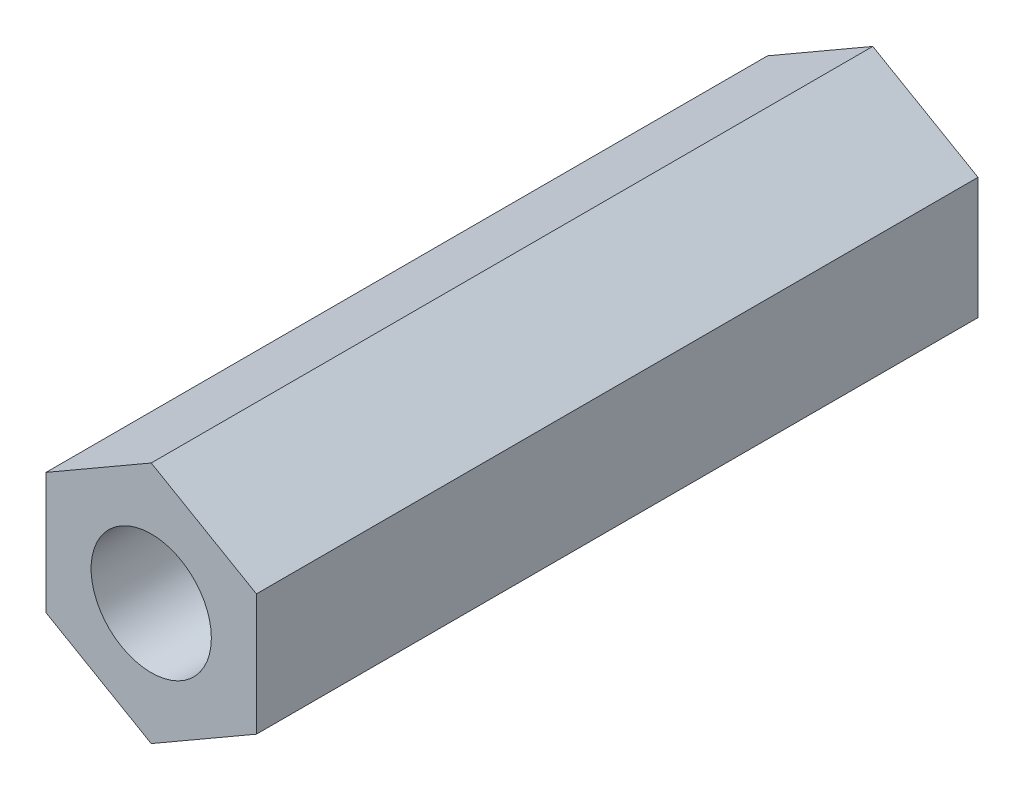
ISO-10303-21;
HEADER;
FILE_DESCRIPTION(('STEP AP214'),'2;1');
FILE_NAME('part.step','',(''),(''),'','','');
FILE_SCHEMA(('AUTOMOTIVE_DESIGN { 1 0 10303 214 1 1 1 1 }'));
ENDSEC;
DATA;
#1=APPLICATION_CONTEXT('core data for automotive mechanical design processes');
#2=APPLICATION_PROTOCOL_DEFINITION('international standard','automotive_design',2000,#1);
#3=PRODUCT_CONTEXT('',#1,'mechanical');
#4=PRODUCT('Part','Part','',(#3));
#5=PRODUCT_RELATED_PRODUCT_CATEGORY('part','',(#4));
#6=PRODUCT_DEFINITION_FORMATION('','',#4);
#7=PRODUCT_DEFINITION_CONTEXT('part definition',#1,'design');
#8=PRODUCT_DEFINITION('design','',#6,#7);
#9=PRODUCT_DEFINITION_SHAPE('','',#8);
#10=(LENGTH_UNIT() NAMED_UNIT(*) SI_UNIT(.MILLI.,.METRE.));
#11=(NAMED_UNIT(*) PLANE_ANGLE_UNIT() SI_UNIT($,.RADIAN.));
#12=(NAMED_UNIT(*) SI_UNIT($,.STERADIAN.) SOLID_ANGLE_UNIT());
#13=UNCERTAINTY_MEASURE_WITH_UNIT(LENGTH_MEASURE(1.E-05),#10,'distance_accuracy_value','');
#14=(GEOMETRIC_REPRESENTATION_CONTEXT(3) GLOBAL_UNCERTAINTY_ASSIGNED_CONTEXT((#13)) GLOBAL_UNIT_ASSIGNED_CONTEXT((#10,
#11,#12)) REPRESENTATION_CONTEXT('',''));
#15=CARTESIAN_POINT('',(0.,0.,0.));
#16=DIRECTION('',(0.,0.,1.));
#17=DIRECTION('',(1.,0.,0.));
#18=AXIS2_PLACEMENT_3D('',#15,#16,#17);
#19=CARTESIAN_POINT('',(3.5,2.02072594216369,24.));
#20=DIRECTION('',(-0.5,-0.866025403784439,0.));
#21=DIRECTION('',(0.866025403784439,-0.5,0.));
#22=AXIS2_PLACEMENT_3D('',#19,#20,#21);
#23=PLANE('',#22);
#24=DIRECTION('',(-0.866025403784439,0.499999999999999,0.));
#25=VECTOR('',#24,1.);
#26=CARTESIAN_POINT('',(3.5,2.02072594216369,0.));
#27=LINE('',#26,#25);
#28=CARTESIAN_POINT('',(3.5,2.02072594216369,0.));
#29=VERTEX_POINT('',#28);
#30=CARTESIAN_POINT('',(0.,4.04145188432738,0.));
#31=VERTEX_POINT('',#30);
#32=EDGE_CURVE('E116',#29,#31,#27,.T.);
#33=ORIENTED_EDGE('',*,*,#32,.T.);
#34=DIRECTION('',(0.,0.,-1.));
#35=VECTOR('',#34,1.);
#36=CARTESIAN_POINT('',(0.,4.04145188432738,24.));
#37=LINE('',#36,#35);
#38=CARTESIAN_POINT('',(0.,4.04145188432738,24.));
#39=VERTEX_POINT('',#38);
#40=EDGE_CURVE('E11',#39,#31,#37,.T.);
#41=ORIENTED_EDGE('',*,*,#40,.F.);
#42=DIRECTION('',(-0.866025403784439,0.499999999999999,0.));
#43=VECTOR('',#42,1.);
#44=CARTESIAN_POINT('',(3.5,2.02072594216369,24.));
#45=LINE('',#44,#43);
#46=CARTESIAN_POINT('',(3.5,2.02072594216369,24.));
#47=VERTEX_POINT('',#46);
#48=EDGE_CURVE('E127',#47,#39,#45,.T.);
#49=ORIENTED_EDGE('',*,*,#48,.F.);
#50=DIRECTION('',(0.,0.,-1.));
#51=VECTOR('',#50,1.);
#52=CARTESIAN_POINT('',(3.5,2.02072594216369,24.));
#53=LINE('',#52,#51);
#54=EDGE_CURVE('E112',#47,#29,#53,.T.);
#55=ORIENTED_EDGE('',*,*,#54,.T.);
#56=EDGE_LOOP('',(#33,#41,#49,#55));
#57=FACE_BOUND('',#56,.T.);
#58=ADVANCED_FACE('F32',(#57),#23,.F.);
#59=CARTESIAN_POINT('',(0.,4.04145188432738,24.));
#60=DIRECTION('',(0.5,-0.866025403784439,0.));
#61=DIRECTION('',(0.866025403784439,0.5,0.));
#62=AXIS2_PLACEMENT_3D('',#59,#60,#61);
#63=PLANE('',#62);
#64=DIRECTION('',(-0.866025403784438,-0.5,0.));
#65=VECTOR('',#64,1.);
#66=CARTESIAN_POINT('',(0.,4.04145188432738,0.));
#67=LINE('',#66,#65);
#68=CARTESIAN_POINT('',(-3.5,2.02072594216369,0.));
#69=VERTEX_POINT('',#68);
#70=EDGE_CURVE('E119',#31,#69,#67,.T.);
#71=ORIENTED_EDGE('',*,*,#70,.T.);
#72=DIRECTION('',(0.,0.,-1.));
#73=VECTOR('',#72,1.);
#74=CARTESIAN_POINT('',(-3.5,2.02072594216369,24.));
#75=LINE('',#74,#73);
#76=CARTESIAN_POINT('',(-3.5,2.02072594216369,24.));
#77=VERTEX_POINT('',#76);
#78=EDGE_CURVE('E40',#77,#69,#75,.T.);
#79=ORIENTED_EDGE('',*,*,#78,.F.);
#80=DIRECTION('',(-0.866025403784438,-0.5,0.));
#81=VECTOR('',#80,1.);
#82=CARTESIAN_POINT('',(0.,4.04145188432738,24.));
#83=LINE('',#82,#81);
#84=EDGE_CURVE('E85',#39,#77,#83,.T.);
#85=ORIENTED_EDGE('',*,*,#84,.F.);
#86=ORIENTED_EDGE('',*,*,#40,.T.);
#87=EDGE_LOOP('',(#71,#79,#85,#86));
#88=FACE_BOUND('',#87,.T.);
#89=ADVANCED_FACE('F152',(#88),#63,.F.);
#90=CARTESIAN_POINT('',(-3.5,2.02072594216369,24.));
#91=DIRECTION('',(1.,0.,0.));
#92=DIRECTION('',(0.,1.,0.));
#93=AXIS2_PLACEMENT_3D('',#90,#91,#92);
#94=PLANE('',#93);
#95=DIRECTION('',(0.,-1.,0.));
#96=VECTOR('',#95,1.);
#97=CARTESIAN_POINT('',(-3.5,2.02072594216369,0.));
#98=LINE('',#97,#96);
#99=CARTESIAN_POINT('',(-3.5,-2.02072594216369,0.));
#100=VERTEX_POINT('',#99);
#101=EDGE_CURVE('E122',#69,#100,#98,.T.);
#102=ORIENTED_EDGE('',*,*,#101,.T.);
#103=DIRECTION('',(0.,0.,-1.));
#104=VECTOR('',#103,1.);
#105=CARTESIAN_POINT('',(-3.5,-2.02072594216369,24.));
#106=LINE('',#105,#104);
#107=CARTESIAN_POINT('',(-3.5,-2.02072594216369,24.));
#108=VERTEX_POINT('',#107);
#109=EDGE_CURVE('E107',#108,#100,#106,.T.);
#110=ORIENTED_EDGE('',*,*,#109,.F.);
#111=DIRECTION('',(0.,-1.,0.));
#112=VECTOR('',#111,1.);
#113=CARTESIAN_POINT('',(-3.5,2.02072594216369,24.));
#114=LINE('',#113,#112);
#115=EDGE_CURVE('E98',#77,#108,#114,.T.);
#116=ORIENTED_EDGE('',*,*,#115,.F.);
#117=ORIENTED_EDGE('',*,*,#78,.T.);
#118=EDGE_LOOP('',(#102,#110,#116,#117));
#119=FACE_BOUND('',#118,.T.);
#120=ADVANCED_FACE('F133',(#119),#94,.F.);
#121=CARTESIAN_POINT('',(-3.5,-2.02072594216369,24.));
#122=DIRECTION('',(0.5,0.866025403784439,0.));
#123=DIRECTION('',(-0.866025403784439,0.5,0.));
#124=AXIS2_PLACEMENT_3D('',#121,#122,#123);
#125=PLANE('',#124);
#126=DIRECTION('',(0.866025403784438,-0.5,0.));
#127=VECTOR('',#126,1.);
#128=CARTESIAN_POINT('',(-3.5,-2.02072594216369,0.));
#129=LINE('',#128,#127);
#130=CARTESIAN_POINT('',(0.,-4.04145188432738,0.));
#131=VERTEX_POINT('',#130);
#132=EDGE_CURVE('E106',#100,#131,#129,.T.);
#133=ORIENTED_EDGE('',*,*,#132,.T.);
#134=DIRECTION('',(0.,0.,-1.));
#135=VECTOR('',#134,1.);
#136=CARTESIAN_POINT('',(0.,-4.04145188432738,24.));
#137=LINE('',#136,#135);
#138=CARTESIAN_POINT('',(0.,-4.04145188432738,24.));
#139=VERTEX_POINT('',#138);
#140=EDGE_CURVE('E103',#139,#131,#137,.T.);
#141=ORIENTED_EDGE('',*,*,#140,.F.);
#142=DIRECTION('',(0.866025403784438,-0.5,0.));
#143=VECTOR('',#142,1.);
#144=CARTESIAN_POINT('',(-3.5,-2.02072594216369,24.));
#145=LINE('',#144,#143);
#146=EDGE_CURVE('E92',#108,#139,#145,.T.);
#147=ORIENTED_EDGE('',*,*,#146,.F.);
#148=ORIENTED_EDGE('',*,*,#109,.T.);
#149=EDGE_LOOP('',(#133,#141,#147,#148));
#150=FACE_BOUND('',#149,.T.);
#151=ADVANCED_FACE('F104',(#150),#125,.F.);
#152=CARTESIAN_POINT('',(0.,-4.04145188432738,24.));
#153=DIRECTION('',(-0.5,0.866025403784439,0.));
#154=DIRECTION('',(-0.866025403784439,-0.5,0.));
#155=AXIS2_PLACEMENT_3D('',#152,#153,#154);
#156=PLANE('',#155);
#157=DIRECTION('',(0.866025403784439,0.5,0.));
#158=VECTOR('',#157,1.);
#159=CARTESIAN_POINT('',(0.,-4.04145188432738,0.));
#160=LINE('',#159,#158);
#161=CARTESIAN_POINT('',(3.5,-2.02072594216369,0.));
#162=VERTEX_POINT('',#161);
#163=EDGE_CURVE('E71',#131,#162,#160,.T.);
#164=ORIENTED_EDGE('',*,*,#163,.T.);
#165=DIRECTION('',(0.,0.,-1.));
#166=VECTOR('',#165,1.);
#167=CARTESIAN_POINT('',(3.5,-2.02072594216369,24.));
#168=LINE('',#167,#166);
#169=CARTESIAN_POINT('',(3.5,-2.02072594216369,24.));
#170=VERTEX_POINT('',#169);
#171=EDGE_CURVE('E108',#170,#162,#168,.T.);
#172=ORIENTED_EDGE('',*,*,#171,.F.);
#173=DIRECTION('',(0.866025403784439,0.5,0.));
#174=VECTOR('',#173,1.);
#175=CARTESIAN_POINT('',(0.,-4.04145188432738,24.));
#176=LINE('',#175,#174);
#177=EDGE_CURVE('E96',#139,#170,#176,.T.);
#178=ORIENTED_EDGE('',*,*,#177,.F.);
#179=ORIENTED_EDGE('',*,*,#140,.T.);
#180=EDGE_LOOP('',(#164,#172,#178,#179));
#181=FACE_BOUND('',#180,.T.);
#182=ADVANCED_FACE('F110',(#181),#156,.F.);
#183=CARTESIAN_POINT('',(3.5,-2.02072594216369,24.));
#184=DIRECTION('',(-1.,0.,0.));
#185=DIRECTION('',(0.,-1.,0.));
#186=AXIS2_PLACEMENT_3D('',#183,#184,#185);
#187=PLANE('',#186);
#188=DIRECTION('',(0.,1.,0.));
#189=VECTOR('',#188,1.);
#190=CARTESIAN_POINT('',(3.5,-2.02072594216369,0.));
#191=LINE('',#190,#189);
#192=EDGE_CURVE('E77',#162,#29,#191,.T.);
#193=ORIENTED_EDGE('',*,*,#192,.T.);
#194=ORIENTED_EDGE('',*,*,#54,.F.);
#195=DIRECTION('',(0.,1.,0.));
#196=VECTOR('',#195,1.);
#197=CARTESIAN_POINT('',(3.5,-2.02072594216369,24.));
#198=LINE('',#197,#196);
#199=EDGE_CURVE('E48',#170,#47,#198,.T.);
#200=ORIENTED_EDGE('',*,*,#199,.F.);
#201=ORIENTED_EDGE('',*,*,#171,.T.);
#202=EDGE_LOOP('',(#193,#194,#200,#201));
#203=FACE_BOUND('',#202,.T.);
#204=ADVANCED_FACE('F140',(#203),#187,.F.);
#205=CARTESIAN_POINT('',(0.,0.,24.));
#206=DIRECTION('',(0.,0.,1.));
#207=DIRECTION('',(1.,0.,0.));
#208=AXIS2_PLACEMENT_3D('',#205,#206,#207);
#209=PLANE('',#208);
#210=CARTESIAN_POINT('',(0.,0.,24.));
#211=DIRECTION('',(0.,0.,1.));
#212=DIRECTION('',(1.,0.,0.));
#213=AXIS2_PLACEMENT_3D('',#210,#211,#212);
#214=CIRCLE('',#213,2.);
#215=CARTESIAN_POINT('',(2.,0.,24.));
#216=VERTEX_POINT('',#215);
#217=EDGE_CURVE('E207',#216,#216,#214,.T.);
#218=ORIENTED_EDGE('',*,*,#217,.F.);
#219=EDGE_LOOP('',(#218));
#220=FACE_BOUND('',#219,.T.);
#221=ORIENTED_EDGE('',*,*,#48,.T.);
#222=ORIENTED_EDGE('',*,*,#84,.T.);
#223=ORIENTED_EDGE('',*,*,#115,.T.);
#224=ORIENTED_EDGE('',*,*,#146,.T.);
#225=ORIENTED_EDGE('',*,*,#177,.T.);
#226=ORIENTED_EDGE('',*,*,#199,.T.);
#227=EDGE_LOOP('',(#221,#222,#223,#224,#225,#226));
#228=FACE_BOUND('',#227,.T.);
#229=ADVANCED_FACE('F94',(#220,#228),#209,.T.);
#230=CARTESIAN_POINT('',(0.,0.,0.));
#231=DIRECTION('',(0.,0.,1.));
#232=DIRECTION('',(1.,0.,0.));
#233=AXIS2_PLACEMENT_3D('',#230,#231,#232);
#234=PLANE('',#233);
#235=CARTESIAN_POINT('',(0.,0.,0.));
#236=DIRECTION('',(0.,0.,1.));
#237=DIRECTION('',(1.,0.,0.));
#238=AXIS2_PLACEMENT_3D('',#235,#236,#237);
#239=CIRCLE('',#238,2.);
#240=CARTESIAN_POINT('',(2.,0.,0.));
#241=VERTEX_POINT('',#240);
#242=EDGE_CURVE('E120',#241,#241,#239,.T.);
#243=ORIENTED_EDGE('',*,*,#242,.T.);
#244=EDGE_LOOP('',(#243));
#245=FACE_BOUND('',#244,.T.);
#246=ORIENTED_EDGE('',*,*,#32,.F.);
#247=ORIENTED_EDGE('',*,*,#192,.F.);
#248=ORIENTED_EDGE('',*,*,#163,.F.);
#249=ORIENTED_EDGE('',*,*,#132,.F.);
#250=ORIENTED_EDGE('',*,*,#101,.F.);
#251=ORIENTED_EDGE('',*,*,#70,.F.);
#252=EDGE_LOOP('',(#246,#247,#248,#249,#250,#251));
#253=FACE_BOUND('',#252,.T.);
#254=ADVANCED_FACE('F136',(#245,#253),#234,.F.);
#255=CARTESIAN_POINT('',(0.,0.,0.));
#256=DIRECTION('',(0.,0.,1.));
#257=DIRECTION('',(1.,0.,0.));
#258=AXIS2_PLACEMENT_3D('',#255,#256,#257);
#259=CYLINDRICAL_SURFACE('',#258,2.);
#260=ORIENTED_EDGE('',*,*,#242,.F.);
#261=EDGE_LOOP('',(#260));
#262=FACE_BOUND('',#261,.T.);
#263=ORIENTED_EDGE('',*,*,#217,.T.);
#264=EDGE_LOOP('',(#263));
#265=FACE_BOUND('',#264,.T.);
#266=ADVANCED_FACE('F189',(#262,#265),#259,.F.);
#267=CLOSED_SHELL('',(#58,#89,#120,#151,#182,#204,#229,#254,#266));
#268=MANIFOLD_SOLID_BREP('B2',#267);
#269=ADVANCED_BREP_SHAPE_REPRESENTATION('',(#18,#268),#14);
#270=SHAPE_DEFINITION_REPRESENTATION(#9,#269);
ENDSEC;
END-ISO-10303-21;
